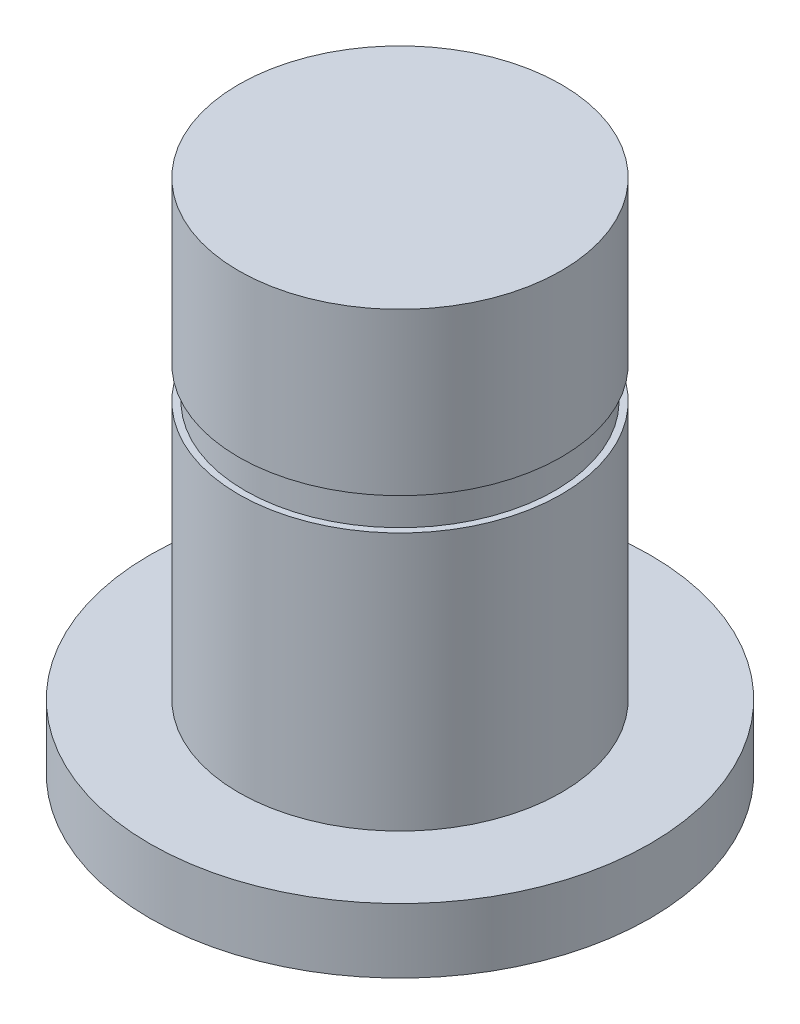
ISO-10303-21;
HEADER;
FILE_DESCRIPTION(('STEP AP214'),'2;1');
FILE_NAME('part.step','',(''),(''),'','','');
FILE_SCHEMA(('AUTOMOTIVE_DESIGN { 1 0 10303 214 1 1 1 1 }'));
ENDSEC;
DATA;
#1=APPLICATION_CONTEXT('core data for automotive mechanical design processes');
#2=APPLICATION_PROTOCOL_DEFINITION('international standard','automotive_design',2000,#1);
#3=PRODUCT_CONTEXT('',#1,'mechanical');
#4=PRODUCT('Part','Part','',(#3));
#5=PRODUCT_RELATED_PRODUCT_CATEGORY('part','',(#4));
#6=PRODUCT_DEFINITION_FORMATION('','',#4);
#7=PRODUCT_DEFINITION_CONTEXT('part definition',#1,'design');
#8=PRODUCT_DEFINITION('design','',#6,#7);
#9=PRODUCT_DEFINITION_SHAPE('','',#8);
#10=(LENGTH_UNIT() NAMED_UNIT(*) SI_UNIT(.MILLI.,.METRE.));
#11=(NAMED_UNIT(*) PLANE_ANGLE_UNIT() SI_UNIT($,.RADIAN.));
#12=(NAMED_UNIT(*) SI_UNIT($,.STERADIAN.) SOLID_ANGLE_UNIT());
#13=UNCERTAINTY_MEASURE_WITH_UNIT(LENGTH_MEASURE(1.E-05),#10,'distance_accuracy_value','');
#14=(GEOMETRIC_REPRESENTATION_CONTEXT(3) GLOBAL_UNCERTAINTY_ASSIGNED_CONTEXT((#13)) GLOBAL_UNIT_ASSIGNED_CONTEXT((#10,
#11,#12)) REPRESENTATION_CONTEXT('',''));
#15=CARTESIAN_POINT('',(0.,0.,0.));
#16=DIRECTION('',(0.,0.,1.));
#17=DIRECTION('',(1.,0.,0.));
#18=AXIS2_PLACEMENT_3D('',#15,#16,#17);
#19=CARTESIAN_POINT('',(0.,25.920310216783,0.));
#20=DIRECTION('',(0.,-1.,0.));
#21=DIRECTION('',(0.,0.,-1.));
#22=AXIS2_PLACEMENT_3D('',#19,#20,#21);
#23=CYLINDRICAL_SURFACE('',#22,7.75);
#24=CARTESIAN_POINT('',(0.,4.,0.));
#25=DIRECTION('',(0.,-1.,0.));
#26=DIRECTION('',(0.,0.,-1.));
#27=AXIS2_PLACEMENT_3D('',#24,#25,#26);
#28=CIRCLE('',#27,7.75);
#29=CARTESIAN_POINT('',(0.,4.,-7.75));
#30=VERTEX_POINT('',#29);
#31=EDGE_CURVE('E10',#30,#30,#28,.F.);
#32=ORIENTED_EDGE('',*,*,#31,.F.);
#33=EDGE_LOOP('',(#32));
#34=FACE_BOUND('',#33,.T.);
#35=CARTESIAN_POINT('',(0.,2.,0.));
#36=DIRECTION('',(0.,-1.,0.));
#37=DIRECTION('',(0.,0.,-1.));
#38=AXIS2_PLACEMENT_3D('',#35,#36,#37);
#39=CIRCLE('',#38,7.75);
#40=CARTESIAN_POINT('',(0.,2.,-7.75));
#41=VERTEX_POINT('',#40);
#42=EDGE_CURVE('E41',#41,#41,#39,.T.);
#43=ORIENTED_EDGE('',*,*,#42,.F.);
#44=EDGE_LOOP('',(#43));
#45=FACE_BOUND('',#44,.T.);
#46=ADVANCED_FACE('F35',(#34,#45),#23,.T.);
#47=CARTESIAN_POINT('',(0.,2.,0.));
#48=DIRECTION('',(0.,-1.,0.));
#49=DIRECTION('',(0.,0.,-1.));
#50=AXIS2_PLACEMENT_3D('',#47,#48,#49);
#51=PLANE('',#50);
#52=ORIENTED_EDGE('',*,*,#42,.T.);
#53=EDGE_LOOP('',(#52));
#54=FACE_BOUND('',#53,.T.);
#55=ADVANCED_FACE('F84',(#54),#51,.T.);
#56=CARTESIAN_POINT('',(0.,4.,0.));
#57=DIRECTION('',(0.,-1.,0.));
#58=DIRECTION('',(0.,0.,-1.));
#59=AXIS2_PLACEMENT_3D('',#56,#57,#58);
#60=PLANE('',#59);
#61=CARTESIAN_POINT('',(0.,4.,0.));
#62=DIRECTION('',(0.,-1.,0.));
#63=DIRECTION('',(0.,0.,-1.));
#64=AXIS2_PLACEMENT_3D('',#61,#62,#63);
#65=CIRCLE('',#64,5.);
#66=CARTESIAN_POINT('',(0.,4.,-5.));
#67=VERTEX_POINT('',#66);
#68=EDGE_CURVE('E49',#67,#67,#65,.T.);
#69=ORIENTED_EDGE('',*,*,#68,.T.);
#70=EDGE_LOOP('',(#69));
#71=FACE_BOUND('',#70,.T.);
#72=ORIENTED_EDGE('',*,*,#31,.T.);
#73=EDGE_LOOP('',(#72));
#74=FACE_BOUND('',#73,.T.);
#75=ADVANCED_FACE('F89',(#71,#74),#60,.F.);
#76=CARTESIAN_POINT('',(0.,12.,0.));
#77=DIRECTION('',(0.,1.,0.));
#78=DIRECTION('',(0.,0.,1.));
#79=AXIS2_PLACEMENT_3D('',#76,#77,#78);
#80=PLANE('',#79);
#81=CARTESIAN_POINT('',(0.,12.,0.));
#82=DIRECTION('',(0.,1.,0.));
#83=DIRECTION('',(0.,0.,1.));
#84=AXIS2_PLACEMENT_3D('',#81,#82,#83);
#85=CIRCLE('',#84,4.8);
#86=CARTESIAN_POINT('',(0.,12.,4.8));
#87=VERTEX_POINT('',#86);
#88=EDGE_CURVE('E57',#87,#87,#85,.T.);
#89=ORIENTED_EDGE('',*,*,#88,.F.);
#90=EDGE_LOOP('',(#89));
#91=FACE_BOUND('',#90,.T.);
#92=CARTESIAN_POINT('',(0.,12.,0.));
#93=DIRECTION('',(0.,1.,0.));
#94=DIRECTION('',(0.,0.,1.));
#95=AXIS2_PLACEMENT_3D('',#92,#93,#94);
#96=CIRCLE('',#95,5.);
#97=CARTESIAN_POINT('',(0.,12.,5.));
#98=VERTEX_POINT('',#97);
#99=EDGE_CURVE('E45',#98,#98,#96,.F.);
#100=ORIENTED_EDGE('',*,*,#99,.F.);
#101=EDGE_LOOP('',(#100));
#102=FACE_BOUND('',#101,.T.);
#103=ADVANCED_FACE('F94',(#91,#102),#80,.T.);
#104=CARTESIAN_POINT('',(0.,26.142135623731,0.));
#105=DIRECTION('',(0.,-1.,0.));
#106=DIRECTION('',(0.,0.,-1.));
#107=AXIS2_PLACEMENT_3D('',#104,#105,#106);
#108=CYLINDRICAL_SURFACE('',#107,5.);
#109=ORIENTED_EDGE('',*,*,#68,.F.);
#110=EDGE_LOOP('',(#109));
#111=FACE_BOUND('',#110,.T.);
#112=ORIENTED_EDGE('',*,*,#99,.T.);
#113=EDGE_LOOP('',(#112));
#114=FACE_BOUND('',#113,.T.);
#115=ADVANCED_FACE('F100',(#111,#114),#108,.T.);
#116=CARTESIAN_POINT('',(0.,26.5764501987817,0.));
#117=DIRECTION('',(0.,-1.,0.));
#118=DIRECTION('',(0.,0.,-1.));
#119=AXIS2_PLACEMENT_3D('',#116,#117,#118);
#120=CYLINDRICAL_SURFACE('',#119,4.8);
#121=ORIENTED_EDGE('',*,*,#88,.T.);
#122=EDGE_LOOP('',(#121));
#123=FACE_BOUND('',#122,.T.);
#124=CARTESIAN_POINT('',(0.,13.,0.));
#125=DIRECTION('',(0.,1.,0.));
#126=DIRECTION('',(0.,0.,1.));
#127=AXIS2_PLACEMENT_3D('',#124,#125,#126);
#128=CIRCLE('',#127,4.8);
#129=CARTESIAN_POINT('',(0.,13.,4.8));
#130=VERTEX_POINT('',#129);
#131=EDGE_CURVE('E54',#130,#130,#128,.T.);
#132=ORIENTED_EDGE('',*,*,#131,.F.);
#133=EDGE_LOOP('',(#132));
#134=FACE_BOUND('',#133,.T.);
#135=ADVANCED_FACE('F81',(#123,#134),#120,.T.);
#136=CARTESIAN_POINT('',(0.,32.142135623731,0.));
#137=DIRECTION('',(0.,-1.,0.));
#138=DIRECTION('',(0.,0.,-1.));
#139=AXIS2_PLACEMENT_3D('',#136,#137,#138);
#140=CYLINDRICAL_SURFACE('',#139,5.);
#141=CARTESIAN_POINT('',(0.,13.,0.));
#142=DIRECTION('',(0.,1.,0.));
#143=DIRECTION('',(0.,0.,1.));
#144=AXIS2_PLACEMENT_3D('',#141,#142,#143);
#145=CIRCLE('',#144,5.);
#146=CARTESIAN_POINT('',(0.,13.,5.));
#147=VERTEX_POINT('',#146);
#148=EDGE_CURVE('E63',#147,#147,#145,.T.);
#149=ORIENTED_EDGE('',*,*,#148,.T.);
#150=EDGE_LOOP('',(#149));
#151=FACE_BOUND('',#150,.T.);
#152=CARTESIAN_POINT('',(0.,18.,0.));
#153=DIRECTION('',(0.,1.,0.));
#154=DIRECTION('',(0.,0.,1.));
#155=AXIS2_PLACEMENT_3D('',#152,#153,#154);
#156=CIRCLE('',#155,5.);
#157=CARTESIAN_POINT('',(0.,18.,5.));
#158=VERTEX_POINT('',#157);
#159=EDGE_CURVE('E60',#158,#158,#156,.T.);
#160=ORIENTED_EDGE('',*,*,#159,.F.);
#161=EDGE_LOOP('',(#160));
#162=FACE_BOUND('',#161,.T.);
#163=ADVANCED_FACE('F67',(#151,#162),#140,.T.);
#164=CARTESIAN_POINT('',(0.,13.,0.));
#165=DIRECTION('',(0.,1.,0.));
#166=DIRECTION('',(0.,0.,1.));
#167=AXIS2_PLACEMENT_3D('',#164,#165,#166);
#168=PLANE('',#167);
#169=ORIENTED_EDGE('',*,*,#131,.T.);
#170=EDGE_LOOP('',(#169));
#171=FACE_BOUND('',#170,.T.);
#172=ORIENTED_EDGE('',*,*,#148,.F.);
#173=EDGE_LOOP('',(#172));
#174=FACE_BOUND('',#173,.T.);
#175=ADVANCED_FACE('F70',(#171,#174),#168,.F.);
#176=CARTESIAN_POINT('',(0.,18.,0.));
#177=DIRECTION('',(0.,1.,0.));
#178=DIRECTION('',(0.,0.,1.));
#179=AXIS2_PLACEMENT_3D('',#176,#177,#178);
#180=PLANE('',#179);
#181=ORIENTED_EDGE('',*,*,#159,.T.);
#182=EDGE_LOOP('',(#181));
#183=FACE_BOUND('',#182,.T.);
#184=ADVANCED_FACE('F72',(#183),#180,.T.);
#185=CLOSED_SHELL('',(#46,#55,#75,#103,#115,#135,#163,#175,#184));
#186=MANIFOLD_SOLID_BREP('B2',#185);
#187=ADVANCED_BREP_SHAPE_REPRESENTATION('',(#18,#186),#14);
#188=SHAPE_DEFINITION_REPRESENTATION(#9,#187);
ENDSEC;
END-ISO-10303-21;
